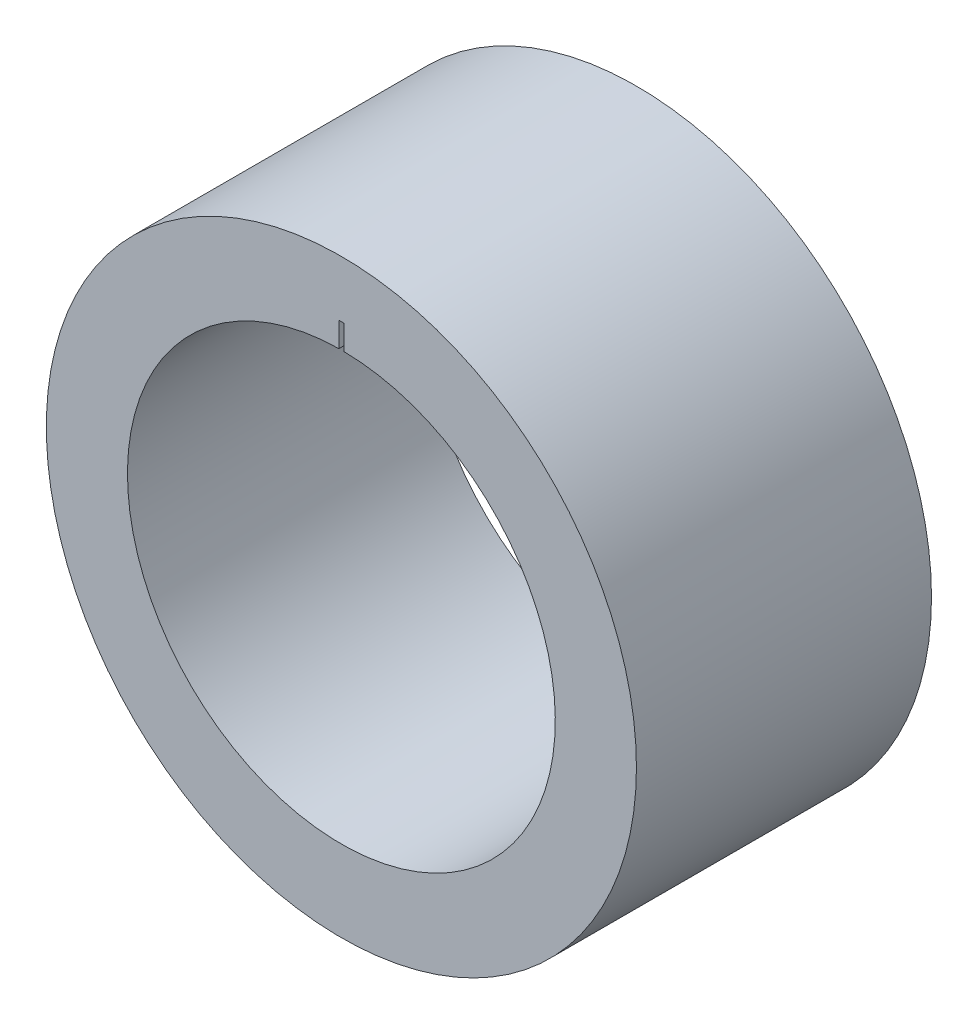
ISO-10303-21;
HEADER;
FILE_DESCRIPTION(('STEP AP214'),'2;1');
FILE_NAME('part.step','',(''),(''),'','','');
FILE_SCHEMA(('AUTOMOTIVE_DESIGN { 1 0 10303 214 1 1 1 1 }'));
ENDSEC;
DATA;
#1=APPLICATION_CONTEXT('core data for automotive mechanical design processes');
#2=APPLICATION_PROTOCOL_DEFINITION('international standard','automotive_design',2000,#1);
#3=PRODUCT_CONTEXT('',#1,'mechanical');
#4=PRODUCT('Part','Part','',(#3));
#5=PRODUCT_RELATED_PRODUCT_CATEGORY('part','',(#4));
#6=PRODUCT_DEFINITION_FORMATION('','',#4);
#7=PRODUCT_DEFINITION_CONTEXT('part definition',#1,'design');
#8=PRODUCT_DEFINITION('design','',#6,#7);
#9=PRODUCT_DEFINITION_SHAPE('','',#8);
#10=(LENGTH_UNIT() NAMED_UNIT(*) SI_UNIT(.MILLI.,.METRE.));
#11=(NAMED_UNIT(*) PLANE_ANGLE_UNIT() SI_UNIT($,.RADIAN.));
#12=(NAMED_UNIT(*) SI_UNIT($,.STERADIAN.) SOLID_ANGLE_UNIT());
#13=UNCERTAINTY_MEASURE_WITH_UNIT(LENGTH_MEASURE(1.E-05),#10,'distance_accuracy_value','');
#14=(GEOMETRIC_REPRESENTATION_CONTEXT(3) GLOBAL_UNCERTAINTY_ASSIGNED_CONTEXT((#13)) GLOBAL_UNIT_ASSIGNED_CONTEXT((#10,
#11,#12)) REPRESENTATION_CONTEXT('',''));
#15=CARTESIAN_POINT('',(0.,0.,0.));
#16=DIRECTION('',(0.,0.,1.));
#17=DIRECTION('',(1.,0.,0.));
#18=AXIS2_PLACEMENT_3D('',#15,#16,#17);
#19=CARTESIAN_POINT('',(0.,0.,60.));
#20=DIRECTION('',(0.,0.,-1.));
#21=DIRECTION('',(-1.,0.,0.));
#22=AXIS2_PLACEMENT_3D('',#19,#20,#21);
#23=CYLINDRICAL_SURFACE('',#22,43.5);
#24=DIRECTION('',(0.,0.,1.));
#25=VECTOR('',#24,1.);
#26=CARTESIAN_POINT('',(0.500000000000019,43.4971263418631,0.));
#27=LINE('',#26,#25);
#28=CARTESIAN_POINT('',(0.500000000000019,43.4971263418631,0.));
#29=VERTEX_POINT('',#28);
#30=CARTESIAN_POINT('',(0.500000000000019,43.4971263418631,60.));
#31=VERTEX_POINT('',#30);
#32=EDGE_CURVE('E103',#29,#31,#27,.T.);
#33=ORIENTED_EDGE('',*,*,#32,.F.);
#34=CARTESIAN_POINT('',(0.,0.,0.));
#35=DIRECTION('',(0.,0.,1.));
#36=DIRECTION('',(1.,0.,0.));
#37=AXIS2_PLACEMENT_3D('',#34,#35,#36);
#38=CIRCLE('',#37,43.5);
#39=CARTESIAN_POINT('',(-0.50000000000001,43.4971263418631,0.));
#40=VERTEX_POINT('',#39);
#41=EDGE_CURVE('E102',#40,#29,#38,.T.);
#42=ORIENTED_EDGE('',*,*,#41,.F.);
#43=DIRECTION('',(0.,0.,1.));
#44=VECTOR('',#43,1.);
#45=CARTESIAN_POINT('',(-0.50000000000001,43.4971263418632,0.));
#46=LINE('',#45,#44);
#47=CARTESIAN_POINT('',(-0.50000000000001,43.4971263418632,60.));
#48=VERTEX_POINT('',#47);
#49=EDGE_CURVE('E49',#40,#48,#46,.T.);
#50=ORIENTED_EDGE('',*,*,#49,.T.);
#51=CARTESIAN_POINT('',(0.,0.,60.));
#52=DIRECTION('',(0.,0.,1.));
#53=DIRECTION('',(1.,0.,0.));
#54=AXIS2_PLACEMENT_3D('',#51,#52,#53);
#55=CIRCLE('',#54,43.5);
#56=EDGE_CURVE('E41',#48,#31,#55,.T.);
#57=ORIENTED_EDGE('',*,*,#56,.T.);
#58=EDGE_LOOP('',(#33,#42,#50,#57));
#59=FACE_BOUND('',#58,.T.);
#60=ADVANCED_FACE('F33',(#59),#23,.F.);
#61=CARTESIAN_POINT('',(0.,0.,60.));
#62=DIRECTION('',(0.,0.,-1.));
#63=DIRECTION('',(-1.,0.,0.));
#64=AXIS2_PLACEMENT_3D('',#61,#62,#63);
#65=CYLINDRICAL_SURFACE('',#64,60.);
#66=CARTESIAN_POINT('',(0.,0.,60.));
#67=DIRECTION('',(0.,0.,1.));
#68=DIRECTION('',(1.,0.,0.));
#69=AXIS2_PLACEMENT_3D('',#66,#67,#68);
#70=CIRCLE('',#69,60.);
#71=CARTESIAN_POINT('',(60.,0.,60.));
#72=VERTEX_POINT('',#71);
#73=EDGE_CURVE('E11',#72,#72,#70,.T.);
#74=ORIENTED_EDGE('',*,*,#73,.F.);
#75=EDGE_LOOP('',(#74));
#76=FACE_BOUND('',#75,.T.);
#77=CARTESIAN_POINT('',(0.,0.,0.));
#78=DIRECTION('',(0.,0.,1.));
#79=DIRECTION('',(1.,0.,0.));
#80=AXIS2_PLACEMENT_3D('',#77,#78,#79);
#81=CIRCLE('',#80,60.);
#82=CARTESIAN_POINT('',(60.,0.,0.));
#83=VERTEX_POINT('',#82);
#84=EDGE_CURVE('E36',#83,#83,#81,.T.);
#85=ORIENTED_EDGE('',*,*,#84,.T.);
#86=EDGE_LOOP('',(#85));
#87=FACE_BOUND('',#86,.T.);
#88=ADVANCED_FACE('F110',(#76,#87),#65,.T.);
#89=CARTESIAN_POINT('',(0.,0.,60.));
#90=DIRECTION('',(0.,0.,1.));
#91=DIRECTION('',(1.,0.,0.));
#92=AXIS2_PLACEMENT_3D('',#89,#90,#91);
#93=PLANE('',#92);
#94=DIRECTION('',(0.,1.,0.));
#95=VECTOR('',#94,1.);
#96=CARTESIAN_POINT('',(0.500000000000018,43.4971263418631,60.));
#97=LINE('',#96,#95);
#98=CARTESIAN_POINT('',(0.5,48.5,60.));
#99=VERTEX_POINT('',#98);
#100=EDGE_CURVE('E93',#31,#99,#97,.T.);
#101=ORIENTED_EDGE('',*,*,#100,.F.);
#102=ORIENTED_EDGE('',*,*,#56,.F.);
#103=DIRECTION('',(0.,-1.,0.));
#104=VECTOR('',#103,1.);
#105=CARTESIAN_POINT('',(-0.5,48.5,60.));
#106=LINE('',#105,#104);
#107=CARTESIAN_POINT('',(-0.5,48.5,60.));
#108=VERTEX_POINT('',#107);
#109=EDGE_CURVE('E95',#108,#48,#106,.T.);
#110=ORIENTED_EDGE('',*,*,#109,.F.);
#111=DIRECTION('',(-1.,0.,0.));
#112=VECTOR('',#111,1.);
#113=CARTESIAN_POINT('',(0.5,48.5,60.));
#114=LINE('',#113,#112);
#115=EDGE_CURVE('E81',#99,#108,#114,.T.);
#116=ORIENTED_EDGE('',*,*,#115,.F.);
#117=EDGE_LOOP('',(#101,#102,#110,#116));
#118=FACE_BOUND('',#117,.T.);
#119=ORIENTED_EDGE('',*,*,#73,.T.);
#120=EDGE_LOOP('',(#119));
#121=FACE_BOUND('',#120,.T.);
#122=ADVANCED_FACE('F112',(#118,#121),#93,.T.);
#123=CARTESIAN_POINT('',(0.,0.,0.));
#124=DIRECTION('',(0.,0.,1.));
#125=DIRECTION('',(1.,0.,0.));
#126=AXIS2_PLACEMENT_3D('',#123,#124,#125);
#127=PLANE('',#126);
#128=ORIENTED_EDGE('',*,*,#41,.T.);
#129=DIRECTION('',(0.,1.,0.));
#130=VECTOR('',#129,1.);
#131=CARTESIAN_POINT('',(0.500000000000018,43.4971263418631,0.));
#132=LINE('',#131,#130);
#133=CARTESIAN_POINT('',(0.5,48.5,0.));
#134=VERTEX_POINT('',#133);
#135=EDGE_CURVE('E83',#29,#134,#132,.T.);
#136=ORIENTED_EDGE('',*,*,#135,.T.);
#137=DIRECTION('',(-1.,0.,0.));
#138=VECTOR('',#137,1.);
#139=CARTESIAN_POINT('',(0.5,48.5,0.));
#140=LINE('',#139,#138);
#141=CARTESIAN_POINT('',(-0.5,48.5,0.));
#142=VERTEX_POINT('',#141);
#143=EDGE_CURVE('E78',#134,#142,#140,.T.);
#144=ORIENTED_EDGE('',*,*,#143,.T.);
#145=DIRECTION('',(0.,-1.,0.));
#146=VECTOR('',#145,1.);
#147=CARTESIAN_POINT('',(-0.5,48.5,0.));
#148=LINE('',#147,#146);
#149=EDGE_CURVE('E85',#142,#40,#148,.T.);
#150=ORIENTED_EDGE('',*,*,#149,.T.);
#151=EDGE_LOOP('',(#128,#136,#144,#150));
#152=FACE_BOUND('',#151,.T.);
#153=ORIENTED_EDGE('',*,*,#84,.F.);
#154=EDGE_LOOP('',(#153));
#155=FACE_BOUND('',#154,.T.);
#156=ADVANCED_FACE('F91',(#152,#155),#127,.F.);
#157=CARTESIAN_POINT('',(0.5,48.5,0.));
#158=DIRECTION('',(0.,1.,0.));
#159=DIRECTION('',(0.,0.,1.));
#160=AXIS2_PLACEMENT_3D('',#157,#158,#159);
#161=PLANE('',#160);
#162=ORIENTED_EDGE('',*,*,#115,.T.);
#163=DIRECTION('',(0.,0.,1.));
#164=VECTOR('',#163,1.);
#165=CARTESIAN_POINT('',(-0.5,48.5,0.));
#166=LINE('',#165,#164);
#167=EDGE_CURVE('E75',#142,#108,#166,.T.);
#168=ORIENTED_EDGE('',*,*,#167,.F.);
#169=ORIENTED_EDGE('',*,*,#143,.F.);
#170=DIRECTION('',(0.,0.,1.));
#171=VECTOR('',#170,1.);
#172=CARTESIAN_POINT('',(0.5,48.5,0.));
#173=LINE('',#172,#171);
#174=EDGE_CURVE('E58',#134,#99,#173,.T.);
#175=ORIENTED_EDGE('',*,*,#174,.T.);
#176=EDGE_LOOP('',(#162,#168,#169,#175));
#177=FACE_BOUND('',#176,.T.);
#178=ADVANCED_FACE('F76',(#177),#161,.F.);
#179=CARTESIAN_POINT('',(0.500000000000018,43.4971263418631,0.));
#180=DIRECTION('',(1.,0.,0.));
#181=DIRECTION('',(0.,1.,0.));
#182=AXIS2_PLACEMENT_3D('',#179,#180,#181);
#183=PLANE('',#182);
#184=ORIENTED_EDGE('',*,*,#100,.T.);
#185=ORIENTED_EDGE('',*,*,#174,.F.);
#186=ORIENTED_EDGE('',*,*,#135,.F.);
#187=ORIENTED_EDGE('',*,*,#32,.T.);
#188=EDGE_LOOP('',(#184,#185,#186,#187));
#189=FACE_BOUND('',#188,.T.);
#190=ADVANCED_FACE('F118',(#189),#183,.F.);
#191=CARTESIAN_POINT('',(-0.5,48.5,0.));
#192=DIRECTION('',(-1.,0.,0.));
#193=DIRECTION('',(0.,-1.,0.));
#194=AXIS2_PLACEMENT_3D('',#191,#192,#193);
#195=PLANE('',#194);
#196=ORIENTED_EDGE('',*,*,#109,.T.);
#197=ORIENTED_EDGE('',*,*,#49,.F.);
#198=ORIENTED_EDGE('',*,*,#149,.F.);
#199=ORIENTED_EDGE('',*,*,#167,.T.);
#200=EDGE_LOOP('',(#196,#197,#198,#199));
#201=FACE_BOUND('',#200,.T.);
#202=ADVANCED_FACE('F86',(#201),#195,.F.);
#203=CLOSED_SHELL('',(#60,#88,#122,#156,#178,#190,#202));
#204=MANIFOLD_SOLID_BREP('B2',#203);
#205=ADVANCED_BREP_SHAPE_REPRESENTATION('',(#18,#204),#14);
#206=SHAPE_DEFINITION_REPRESENTATION(#9,#205);
ENDSEC;
END-ISO-10303-21;
